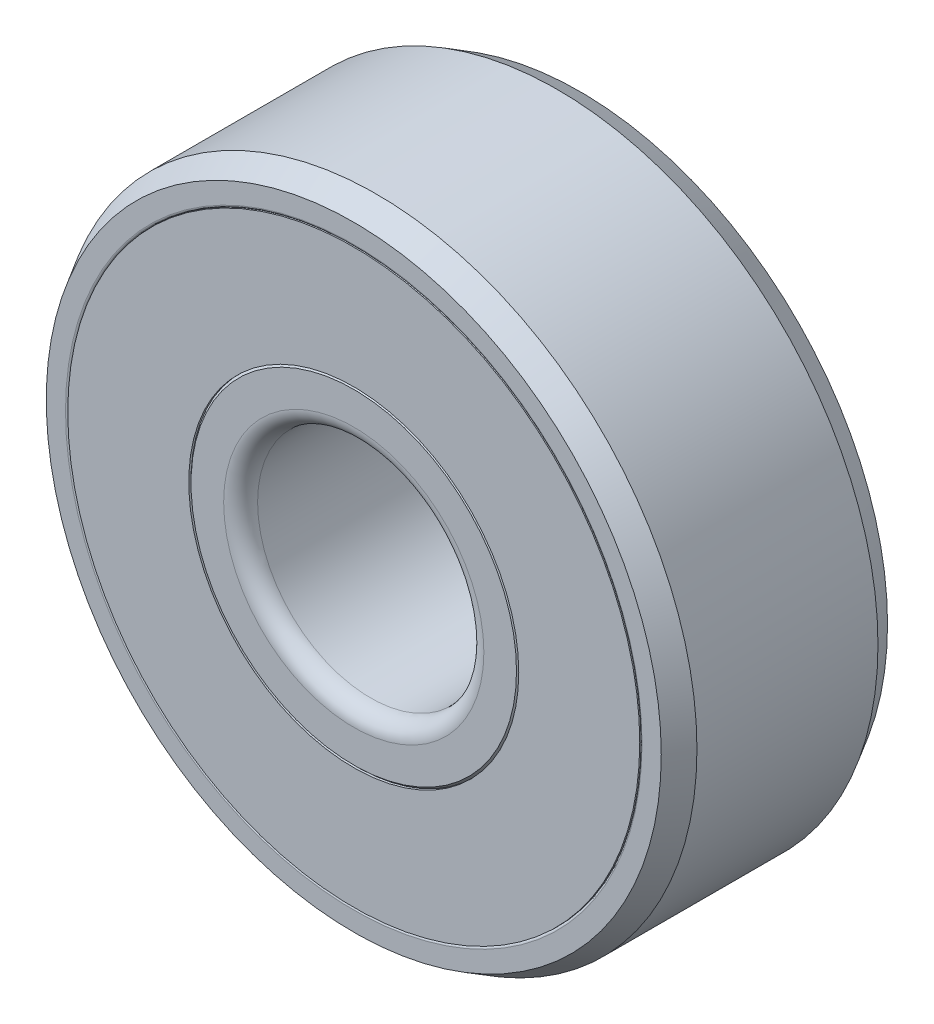
ISO-10303-21;
HEADER;
FILE_DESCRIPTION(('STEP AP214'),'2;1');
FILE_NAME('part.step','',(''),(''),'','','');
FILE_SCHEMA(('AUTOMOTIVE_DESIGN { 1 0 10303 214 1 1 1 1 }'));
ENDSEC;
DATA;
#1=APPLICATION_CONTEXT('core data for automotive mechanical design processes');
#2=APPLICATION_PROTOCOL_DEFINITION('international standard','automotive_design',2000,#1);
#3=PRODUCT_CONTEXT('',#1,'mechanical');
#4=PRODUCT('Part','Part','',(#3));
#5=PRODUCT_RELATED_PRODUCT_CATEGORY('part','',(#4));
#6=PRODUCT_DEFINITION_FORMATION('','',#4);
#7=PRODUCT_DEFINITION_CONTEXT('part definition',#1,'design');
#8=PRODUCT_DEFINITION('design','',#6,#7);
#9=PRODUCT_DEFINITION_SHAPE('','',#8);
#10=(LENGTH_UNIT() NAMED_UNIT(*) SI_UNIT(.MILLI.,.METRE.));
#11=(NAMED_UNIT(*) PLANE_ANGLE_UNIT() SI_UNIT($,.RADIAN.));
#12=(NAMED_UNIT(*) SI_UNIT($,.STERADIAN.) SOLID_ANGLE_UNIT());
#13=UNCERTAINTY_MEASURE_WITH_UNIT(LENGTH_MEASURE(1.E-05),#10,'distance_accuracy_value','');
#14=(GEOMETRIC_REPRESENTATION_CONTEXT(3) GLOBAL_UNCERTAINTY_ASSIGNED_CONTEXT((#13)) GLOBAL_UNIT_ASSIGNED_CONTEXT((#10,
#11,#12)) REPRESENTATION_CONTEXT('',''));
#15=CARTESIAN_POINT('',(0.,0.,0.));
#16=DIRECTION('',(0.,0.,1.));
#17=DIRECTION('',(1.,0.,0.));
#18=AXIS2_PLACEMENT_3D('',#15,#16,#17);
#19=CARTESIAN_POINT('',(4.67470073892338,-3.7279494402804,0.));
#20=DIRECTION('',(-0.781831482468022,0.623489801858743,0.));
#21=DIRECTION('',(0.,0.,-1.));
#22=AXIS2_PLACEMENT_3D('',#19,#20,#21);
#23=SPHERICAL_SURFACE('',#22,2.21527777777778);
#24=CARTESIAN_POINT('',(2.94272682984492,-2.34674633755166,0.));
#25=VERTEX_POINT('',#24);
#26=VERTEX_LOOP('',#25);
#27=FACE_BOUND('',#26,.T.);
#28=ADVANCED_FACE('F41',(#27),#23,.T.);
#29=CLOSED_SHELL('',(#28));
#30=MANIFOLD_SOLID_BREP('B2',#29);
#31=CARTESIAN_POINT('',(5.8292564749205,1.33048975094707,0.));
#32=DIRECTION('',(-0.974927912181826,-0.222520933956305,0.));
#33=DIRECTION('',(0.,0.,-1.));
#34=AXIS2_PLACEMENT_3D('',#31,#32,#33);
#35=SPHERICAL_SURFACE('',#34,2.21527777777778);
#36=CARTESIAN_POINT('',(3.66952033612882,0.837544070863315,0.));
#37=VERTEX_POINT('',#36);
#38=VERTEX_LOOP('',#37);
#39=FACE_BOUND('',#38,.T.);
#40=ADVANCED_FACE('F59',(#39),#35,.T.);
#41=CLOSED_SHELL('',(#40));
#42=MANIFOLD_SOLID_BREP('B6',#41);
#43=CARTESIAN_POINT('',(2.59426319014044,5.38704302266653,0.));
#44=DIRECTION('',(-0.433883739117565,-0.900968867902416,0.));
#45=DIRECTION('',(0.,0.,-1.));
#46=AXIS2_PLACEMENT_3D('',#43,#44,#45);
#47=SPHERICAL_SURFACE('',#46,2.21527777777778);
#48=CARTESIAN_POINT('',(1.63309018473417,3.3911467111327,0.));
#49=VERTEX_POINT('',#48);
#50=VERTEX_LOOP('',#49);
#51=FACE_BOUND('',#50,.T.);
#52=ADVANCED_FACE('F77',(#51),#47,.T.);
#53=CLOSED_SHELL('',(#52));
#54=MANIFOLD_SOLID_BREP('B37',#53);
#55=CARTESIAN_POINT('',(-2.59426319014037,5.38704302266656,0.));
#56=DIRECTION('',(0.433883739117553,-0.900968867902422,0.));
#57=DIRECTION('',(0.,0.,-1.));
#58=AXIS2_PLACEMENT_3D('',#55,#56,#57);
#59=SPHERICAL_SURFACE('',#58,2.21527777777778);
#60=CARTESIAN_POINT('',(-1.63309018473412,3.39114671113273,0.));
#61=VERTEX_POINT('',#60);
#62=VERTEX_LOOP('',#61);
#63=FACE_BOUND('',#62,.T.);
#64=ADVANCED_FACE('F95',(#63),#59,.T.);
#65=CLOSED_SHELL('',(#64));
#66=MANIFOLD_SOLID_BREP('B55',#65);
#67=CARTESIAN_POINT('',(-5.82925647492048,1.33048975094715,0.));
#68=DIRECTION('',(0.974927912181823,-0.222520933956318,0.));
#69=DIRECTION('',(0.,0.,-1.));
#70=AXIS2_PLACEMENT_3D('',#67,#68,#69);
#71=SPHERICAL_SURFACE('',#70,2.21527777777778);
#72=CARTESIAN_POINT('',(-3.66952033612881,0.837544070863364,0.));
#73=VERTEX_POINT('',#72);
#74=VERTEX_LOOP('',#73);
#75=FACE_BOUND('',#74,.T.);
#76=ADVANCED_FACE('F113',(#75),#71,.T.);
#77=CLOSED_SHELL('',(#76));
#78=MANIFOLD_SOLID_BREP('B73',#77);
#79=CARTESIAN_POINT('',(-4.67470073892344,-3.72794944028034,0.));
#80=DIRECTION('',(0.781831482468031,0.623489801858732,0.));
#81=DIRECTION('',(0.,0.,-1.));
#82=AXIS2_PLACEMENT_3D('',#79,#80,#81);
#83=SPHERICAL_SURFACE('',#82,2.21527777777778);
#84=CARTESIAN_POINT('',(-2.94272682984495,-2.34674633755162,0.));
#85=VERTEX_POINT('',#84);
#86=VERTEX_LOOP('',#85);
#87=FACE_BOUND('',#86,.T.);
#88=ADVANCED_FACE('F131',(#87),#83,.T.);
#89=CLOSED_SHELL('',(#88));
#90=MANIFOLD_SOLID_BREP('B91',#89);
#91=CARTESIAN_POINT('',(0.,-5.97916666666667,0.));
#92=DIRECTION('',(0.,1.,0.));
#93=DIRECTION('',(0.,0.,-1.));
#94=AXIS2_PLACEMENT_3D('',#91,#92,#93);
#95=SPHERICAL_SURFACE('',#94,2.21527777777778);
#96=CARTESIAN_POINT('',(0.,-3.76388888888889,0.));
#97=VERTEX_POINT('',#96);
#98=VERTEX_LOOP('',#97);
#99=FACE_BOUND('',#98,.T.);
#100=ADVANCED_FACE('F151',(#99),#95,.T.);
#101=CLOSED_SHELL('',(#100));
#102=MANIFOLD_SOLID_BREP('B109',#101);
#103=CARTESIAN_POINT('',(0.,-4.375,3.));
#104=DIRECTION('',(0.,0.,1.));
#105=DIRECTION('',(1.,0.,0.));
#106=AXIS2_PLACEMENT_3D('',#103,#104,#105);
#107=PLANE('',#106);
#108=CARTESIAN_POINT('',(0.,0.,3.));
#109=DIRECTION('',(0.,0.,1.));
#110=DIRECTION('',(1.,0.,0.));
#111=AXIS2_PLACEMENT_3D('',#108,#109,#110);
#112=CIRCLE('',#111,7.58333333333333);
#113=CARTESIAN_POINT('',(7.58333333333333,0.,3.));
#114=VERTEX_POINT('',#113);
#115=EDGE_CURVE('E150',#114,#114,#112,.T.);
#116=ORIENTED_EDGE('',*,*,#115,.T.);
#117=EDGE_LOOP('',(#116));
#118=FACE_BOUND('',#117,.T.);
#119=CARTESIAN_POINT('',(0.,0.,3.));
#120=DIRECTION('',(0.,0.,1.));
#121=DIRECTION('',(1.,0.,0.));
#122=AXIS2_PLACEMENT_3D('',#119,#120,#121);
#123=CIRCLE('',#122,4.375);
#124=CARTESIAN_POINT('',(4.375,0.,3.));
#125=VERTEX_POINT('',#124);
#126=EDGE_CURVE('E185',#125,#125,#123,.T.);
#127=ORIENTED_EDGE('',*,*,#126,.F.);
#128=EDGE_LOOP('',(#127));
#129=FACE_BOUND('',#128,.T.);
#130=ADVANCED_FACE('F171',(#118,#129),#107,.T.);
#131=CARTESIAN_POINT('',(0.,0.,3.));
#132=DIRECTION('',(0.,0.,1.));
#133=DIRECTION('',(1.,0.,0.));
#134=AXIS2_PLACEMENT_3D('',#131,#132,#133);
#135=CYLINDRICAL_SURFACE('',#134,7.58333333333333);
#136=CARTESIAN_POINT('',(0.,0.,2.41145833333333));
#137=DIRECTION('',(0.,0.,1.));
#138=DIRECTION('',(1.,0.,0.));
#139=AXIS2_PLACEMENT_3D('',#136,#137,#138);
#140=CIRCLE('',#139,7.58333333333333);
#141=CARTESIAN_POINT('',(7.58333333333333,0.,2.41145833333333));
#142=VERTEX_POINT('',#141);
#143=EDGE_CURVE('E177',#142,#142,#140,.T.);
#144=ORIENTED_EDGE('',*,*,#143,.T.);
#145=EDGE_LOOP('',(#144));
#146=FACE_BOUND('',#145,.T.);
#147=ORIENTED_EDGE('',*,*,#115,.F.);
#148=EDGE_LOOP('',(#147));
#149=FACE_BOUND('',#148,.T.);
#150=ADVANCED_FACE('F195',(#146,#149),#135,.T.);
#151=CARTESIAN_POINT('',(0.,-4.375,2.41145833333333));
#152=DIRECTION('',(0.,0.,-1.));
#153=DIRECTION('',(-1.,0.,0.));
#154=AXIS2_PLACEMENT_3D('',#151,#152,#153);
#155=PLANE('',#154);
#156=CARTESIAN_POINT('',(0.,0.,2.41145833333333));
#157=DIRECTION('',(0.,0.,1.));
#158=DIRECTION('',(1.,0.,0.));
#159=AXIS2_PLACEMENT_3D('',#156,#157,#158);
#160=CIRCLE('',#159,4.375);
#161=CARTESIAN_POINT('',(4.375,0.,2.41145833333333));
#162=VERTEX_POINT('',#161);
#163=EDGE_CURVE('E181',#162,#162,#160,.T.);
#164=ORIENTED_EDGE('',*,*,#163,.T.);
#165=EDGE_LOOP('',(#164));
#166=FACE_BOUND('',#165,.T.);
#167=ORIENTED_EDGE('',*,*,#143,.F.);
#168=EDGE_LOOP('',(#167));
#169=FACE_BOUND('',#168,.T.);
#170=ADVANCED_FACE('F199',(#166,#169),#155,.T.);
#171=CARTESIAN_POINT('',(0.,0.,3.));
#172=DIRECTION('',(0.,0.,1.));
#173=DIRECTION('',(1.,0.,0.));
#174=AXIS2_PLACEMENT_3D('',#171,#172,#173);
#175=CYLINDRICAL_SURFACE('',#174,4.375);
#176=ORIENTED_EDGE('',*,*,#126,.T.);
#177=EDGE_LOOP('',(#176));
#178=FACE_BOUND('',#177,.T.);
#179=ORIENTED_EDGE('',*,*,#163,.F.);
#180=EDGE_LOOP('',(#179));
#181=FACE_BOUND('',#180,.T.);
#182=ADVANCED_FACE('F191',(#178,#181),#175,.F.);
#183=CLOSED_SHELL('',(#130,#150,#170,#182));
#184=MANIFOLD_SOLID_BREP('B127',#183);
#185=CARTESIAN_POINT('',(0.,0.,2.55));
#186=DIRECTION('',(0.,0.,1.));
#187=DIRECTION('',(1.,0.,0.));
#188=AXIS2_PLACEMENT_3D('',#185,#186,#187);
#189=TOROIDAL_SURFACE('',#188,3.45,0.45);
#190=CARTESIAN_POINT('',(0.,0.,3.));
#191=DIRECTION('',(0.,0.,1.));
#192=DIRECTION('',(1.,0.,0.));
#193=AXIS2_PLACEMENT_3D('',#190,#191,#192);
#194=CIRCLE('',#193,3.45);
#195=CARTESIAN_POINT('',(3.45,0.,3.));
#196=VERTEX_POINT('',#195);
#197=EDGE_CURVE('E170',#196,#196,#194,.T.);
#198=ORIENTED_EDGE('',*,*,#197,.T.);
#199=EDGE_LOOP('',(#198));
#200=FACE_BOUND('',#199,.T.);
#201=CARTESIAN_POINT('',(0.,0.,2.55));
#202=DIRECTION('',(0.,0.,1.));
#203=DIRECTION('',(1.,0.,0.));
#204=AXIS2_PLACEMENT_3D('',#201,#202,#203);
#205=CIRCLE('',#204,3.);
#206=CARTESIAN_POINT('',(3.,0.,2.55));
#207=VERTEX_POINT('',#206);
#208=EDGE_CURVE('E273',#207,#207,#205,.T.);
#209=ORIENTED_EDGE('',*,*,#208,.F.);
#210=EDGE_LOOP('',(#209));
#211=FACE_BOUND('',#210,.T.);
#212=ADVANCED_FACE('F239',(#200,#211),#189,.T.);
#213=CARTESIAN_POINT('',(0.,-4.315,3.));
#214=DIRECTION('',(0.,0.,1.));
#215=DIRECTION('',(1.,0.,0.));
#216=AXIS2_PLACEMENT_3D('',#213,#214,#215);
#217=PLANE('',#216);
#218=CARTESIAN_POINT('',(0.,0.,3.));
#219=DIRECTION('',(0.,0.,1.));
#220=DIRECTION('',(1.,0.,0.));
#221=AXIS2_PLACEMENT_3D('',#218,#219,#220);
#222=CIRCLE('',#221,4.315);
#223=CARTESIAN_POINT('',(4.315,0.,3.));
#224=VERTEX_POINT('',#223);
#225=EDGE_CURVE('E245',#224,#224,#222,.T.);
#226=ORIENTED_EDGE('',*,*,#225,.T.);
#227=EDGE_LOOP('',(#226));
#228=FACE_BOUND('',#227,.T.);
#229=ORIENTED_EDGE('',*,*,#197,.F.);
#230=EDGE_LOOP('',(#229));
#231=FACE_BOUND('',#230,.T.);
#232=ADVANCED_FACE('F281',(#228,#231),#217,.T.);
#233=CARTESIAN_POINT('',(0.,0.,3.));
#234=DIRECTION('',(0.,0.,-1.));
#235=DIRECTION('',(-1.,0.,0.));
#236=AXIS2_PLACEMENT_3D('',#233,#234,#235);
#237=CONICAL_SURFACE('',#236,4.315,0.785398163397452);
#238=CARTESIAN_POINT('',(0.,0.,2.94));
#239=DIRECTION('',(0.,0.,1.));
#240=DIRECTION('',(1.,0.,0.));
#241=AXIS2_PLACEMENT_3D('',#238,#239,#240);
#242=CIRCLE('',#241,4.375);
#243=CARTESIAN_POINT('',(4.375,0.,2.94));
#244=VERTEX_POINT('',#243);
#245=EDGE_CURVE('E249',#244,#244,#242,.T.);
#246=ORIENTED_EDGE('',*,*,#245,.T.);
#247=EDGE_LOOP('',(#246));
#248=FACE_BOUND('',#247,.T.);
#249=ORIENTED_EDGE('',*,*,#225,.F.);
#250=EDGE_LOOP('',(#249));
#251=FACE_BOUND('',#250,.T.);
#252=ADVANCED_FACE('F285',(#248,#251),#237,.T.);
#253=CARTESIAN_POINT('',(0.,0.,3.));
#254=DIRECTION('',(0.,0.,1.));
#255=DIRECTION('',(1.,0.,0.));
#256=AXIS2_PLACEMENT_3D('',#253,#254,#255);
#257=CYLINDRICAL_SURFACE('',#256,4.375);
#258=CARTESIAN_POINT('',(0.,0.,1.52777777777778));
#259=DIRECTION('',(0.,0.,1.));
#260=DIRECTION('',(1.,0.,0.));
#261=AXIS2_PLACEMENT_3D('',#258,#259,#260);
#262=CIRCLE('',#261,4.375);
#263=CARTESIAN_POINT('',(4.375,0.,1.52777777777778));
#264=VERTEX_POINT('',#263);
#265=EDGE_CURVE('E253',#264,#264,#262,.T.);
#266=ORIENTED_EDGE('',*,*,#265,.T.);
#267=EDGE_LOOP('',(#266));
#268=FACE_BOUND('',#267,.T.);
#269=ORIENTED_EDGE('',*,*,#245,.F.);
#270=EDGE_LOOP('',(#269));
#271=FACE_BOUND('',#270,.T.);
#272=ADVANCED_FACE('F289',(#268,#271),#257,.T.);
#273=CARTESIAN_POINT('',(0.,0.,0.));
#274=DIRECTION('',(0.,0.,1.));
#275=DIRECTION('',(1.,0.,0.));
#276=AXIS2_PLACEMENT_3D('',#273,#274,#275);
#277=TOROIDAL_SURFACE('',#276,5.97916666666667,2.21527777777778);
#278=CARTESIAN_POINT('',(0.,0.,-1.52777777777778));
#279=DIRECTION('',(0.,0.,1.));
#280=DIRECTION('',(1.,0.,0.));
#281=AXIS2_PLACEMENT_3D('',#278,#279,#280);
#282=CIRCLE('',#281,4.375);
#283=CARTESIAN_POINT('',(4.375,0.,-1.52777777777778));
#284=VERTEX_POINT('',#283);
#285=EDGE_CURVE('E258',#284,#284,#282,.T.);
#286=ORIENTED_EDGE('',*,*,#285,.T.);
#287=EDGE_LOOP('',(#286));
#288=FACE_BOUND('',#287,.T.);
#289=ORIENTED_EDGE('',*,*,#265,.F.);
#290=EDGE_LOOP('',(#289));
#291=FACE_BOUND('',#290,.T.);
#292=ADVANCED_FACE('F296',(#288,#291),#277,.F.);
#293=CARTESIAN_POINT('',(0.,0.,3.));
#294=DIRECTION('',(0.,0.,1.));
#295=DIRECTION('',(1.,0.,0.));
#296=AXIS2_PLACEMENT_3D('',#293,#294,#295);
#297=CYLINDRICAL_SURFACE('',#296,4.375);
#298=CARTESIAN_POINT('',(0.,0.,-2.94));
#299=DIRECTION('',(0.,0.,1.));
#300=DIRECTION('',(1.,0.,0.));
#301=AXIS2_PLACEMENT_3D('',#298,#299,#300);
#302=CIRCLE('',#301,4.375);
#303=CARTESIAN_POINT('',(4.375,0.,-2.94));
#304=VERTEX_POINT('',#303);
#305=EDGE_CURVE('E261',#304,#304,#302,.T.);
#306=ORIENTED_EDGE('',*,*,#305,.T.);
#307=EDGE_LOOP('',(#306));
#308=FACE_BOUND('',#307,.T.);
#309=ORIENTED_EDGE('',*,*,#285,.F.);
#310=EDGE_LOOP('',(#309));
#311=FACE_BOUND('',#310,.T.);
#312=ADVANCED_FACE('F300',(#308,#311),#297,.T.);
#313=CARTESIAN_POINT('',(0.,0.,-2.94));
#314=DIRECTION('',(0.,0.,1.));
#315=DIRECTION('',(1.,0.,0.));
#316=AXIS2_PLACEMENT_3D('',#313,#314,#315);
#317=CONICAL_SURFACE('',#316,4.375,0.785398163397455);
#318=CARTESIAN_POINT('',(0.,0.,-3.));
#319=DIRECTION('',(0.,0.,1.));
#320=DIRECTION('',(1.,0.,0.));
#321=AXIS2_PLACEMENT_3D('',#318,#319,#320);
#322=CIRCLE('',#321,4.315);
#323=CARTESIAN_POINT('',(4.315,0.,-3.));
#324=VERTEX_POINT('',#323);
#325=EDGE_CURVE('E264',#324,#324,#322,.T.);
#326=ORIENTED_EDGE('',*,*,#325,.T.);
#327=EDGE_LOOP('',(#326));
#328=FACE_BOUND('',#327,.T.);
#329=ORIENTED_EDGE('',*,*,#305,.F.);
#330=EDGE_LOOP('',(#329));
#331=FACE_BOUND('',#330,.T.);
#332=ADVANCED_FACE('F304',(#328,#331),#317,.T.);
#333=CARTESIAN_POINT('',(0.,-4.315,-3.));
#334=DIRECTION('',(0.,0.,-1.));
#335=DIRECTION('',(-1.,0.,0.));
#336=AXIS2_PLACEMENT_3D('',#333,#334,#335);
#337=PLANE('',#336);
#338=CARTESIAN_POINT('',(0.,0.,-3.));
#339=DIRECTION('',(0.,0.,1.));
#340=DIRECTION('',(1.,0.,0.));
#341=AXIS2_PLACEMENT_3D('',#338,#339,#340);
#342=CIRCLE('',#341,3.45);
#343=CARTESIAN_POINT('',(3.45,0.,-3.));
#344=VERTEX_POINT('',#343);
#345=EDGE_CURVE('E267',#344,#344,#342,.T.);
#346=ORIENTED_EDGE('',*,*,#345,.T.);
#347=EDGE_LOOP('',(#346));
#348=FACE_BOUND('',#347,.T.);
#349=ORIENTED_EDGE('',*,*,#325,.F.);
#350=EDGE_LOOP('',(#349));
#351=FACE_BOUND('',#350,.T.);
#352=ADVANCED_FACE('F308',(#348,#351),#337,.T.);
#353=CARTESIAN_POINT('',(0.,0.,-2.55));
#354=DIRECTION('',(0.,0.,1.));
#355=DIRECTION('',(1.,0.,0.));
#356=AXIS2_PLACEMENT_3D('',#353,#354,#355);
#357=TOROIDAL_SURFACE('',#356,3.45,0.45);
#358=CARTESIAN_POINT('',(0.,0.,-2.55));
#359=DIRECTION('',(0.,0.,1.));
#360=DIRECTION('',(1.,0.,0.));
#361=AXIS2_PLACEMENT_3D('',#358,#359,#360);
#362=CIRCLE('',#361,3.);
#363=CARTESIAN_POINT('',(3.,0.,-2.55));
#364=VERTEX_POINT('',#363);
#365=EDGE_CURVE('E270',#364,#364,#362,.T.);
#366=ORIENTED_EDGE('',*,*,#365,.T.);
#367=EDGE_LOOP('',(#366));
#368=FACE_BOUND('',#367,.T.);
#369=ORIENTED_EDGE('',*,*,#345,.F.);
#370=EDGE_LOOP('',(#369));
#371=FACE_BOUND('',#370,.T.);
#372=ADVANCED_FACE('F312',(#368,#371),#357,.T.);
#373=CARTESIAN_POINT('',(0.,0.,3.));
#374=DIRECTION('',(0.,0.,1.));
#375=DIRECTION('',(1.,0.,0.));
#376=AXIS2_PLACEMENT_3D('',#373,#374,#375);
#377=CYLINDRICAL_SURFACE('',#376,3.);
#378=ORIENTED_EDGE('',*,*,#208,.T.);
#379=EDGE_LOOP('',(#378));
#380=FACE_BOUND('',#379,.T.);
#381=ORIENTED_EDGE('',*,*,#365,.F.);
#382=EDGE_LOOP('',(#381));
#383=FACE_BOUND('',#382,.T.);
#384=ADVANCED_FACE('F277',(#380,#383),#377,.F.);
#385=CLOSED_SHELL('',(#212,#232,#252,#272,#292,#312,#332,#352,#372,#384));
#386=MANIFOLD_SOLID_BREP('B145',#385);
#387=CARTESIAN_POINT('',(0.,0.,3.));
#388=DIRECTION('',(0.,0.,-1.));
#389=DIRECTION('',(-1.,0.,0.));
#390=AXIS2_PLACEMENT_3D('',#387,#388,#389);
#391=CONICAL_SURFACE('',#390,8.15358983848624,0.523598775598278);
#392=CARTESIAN_POINT('',(0.,0.,2.4));
#393=DIRECTION('',(0.,0.,1.));
#394=DIRECTION('',(1.,0.,0.));
#395=AXIS2_PLACEMENT_3D('',#392,#393,#394);
#396=CIRCLE('',#395,8.5);
#397=CARTESIAN_POINT('',(8.5,0.,2.4));
#398=VERTEX_POINT('',#397);
#399=EDGE_CURVE('E238',#398,#398,#396,.T.);
#400=ORIENTED_EDGE('',*,*,#399,.T.);
#401=EDGE_LOOP('',(#400));
#402=FACE_BOUND('',#401,.T.);
#403=CARTESIAN_POINT('',(0.,0.,3.));
#404=DIRECTION('',(0.,0.,1.));
#405=DIRECTION('',(1.,0.,0.));
#406=AXIS2_PLACEMENT_3D('',#403,#404,#405);
#407=CIRCLE('',#406,8.15358983848624);
#408=CARTESIAN_POINT('',(8.15358983848624,0.,3.));
#409=VERTEX_POINT('',#408);
#410=EDGE_CURVE('E424',#409,#409,#407,.T.);
#411=ORIENTED_EDGE('',*,*,#410,.F.);
#412=EDGE_LOOP('',(#411));
#413=FACE_BOUND('',#412,.T.);
#414=ADVANCED_FACE('F390',(#402,#413),#391,.T.);
#415=CARTESIAN_POINT('',(0.,0.,3.));
#416=DIRECTION('',(0.,0.,1.));
#417=DIRECTION('',(1.,0.,0.));
#418=AXIS2_PLACEMENT_3D('',#415,#416,#417);
#419=CYLINDRICAL_SURFACE('',#418,8.5);
#420=CARTESIAN_POINT('',(0.,0.,-2.4));
#421=DIRECTION('',(0.,0.,1.));
#422=DIRECTION('',(1.,0.,0.));
#423=AXIS2_PLACEMENT_3D('',#420,#421,#422);
#424=CIRCLE('',#423,8.5);
#425=CARTESIAN_POINT('',(8.5,0.,-2.4));
#426=VERTEX_POINT('',#425);
#427=EDGE_CURVE('E396',#426,#426,#424,.T.);
#428=ORIENTED_EDGE('',*,*,#427,.T.);
#429=EDGE_LOOP('',(#428));
#430=FACE_BOUND('',#429,.T.);
#431=ORIENTED_EDGE('',*,*,#399,.F.);
#432=EDGE_LOOP('',(#431));
#433=FACE_BOUND('',#432,.T.);
#434=ADVANCED_FACE('F432',(#430,#433),#419,.T.);
#435=CARTESIAN_POINT('',(0.,0.,-2.4));
#436=DIRECTION('',(0.,0.,1.));
#437=DIRECTION('',(1.,0.,0.));
#438=AXIS2_PLACEMENT_3D('',#435,#436,#437);
#439=CONICAL_SURFACE('',#438,8.5,0.523598775598278);
#440=CARTESIAN_POINT('',(0.,0.,-3.));
#441=DIRECTION('',(0.,0.,1.));
#442=DIRECTION('',(1.,0.,0.));
#443=AXIS2_PLACEMENT_3D('',#440,#441,#442);
#444=CIRCLE('',#443,8.15358983848624);
#445=CARTESIAN_POINT('',(8.15358983848624,0.,-3.));
#446=VERTEX_POINT('',#445);
#447=EDGE_CURVE('E400',#446,#446,#444,.T.);
#448=ORIENTED_EDGE('',*,*,#447,.T.);
#449=EDGE_LOOP('',(#448));
#450=FACE_BOUND('',#449,.T.);
#451=ORIENTED_EDGE('',*,*,#427,.F.);
#452=EDGE_LOOP('',(#451));
#453=FACE_BOUND('',#452,.T.);
#454=ADVANCED_FACE('F436',(#450,#453),#439,.T.);
#455=CARTESIAN_POINT('',(0.,-7.64333333333333,-3.));
#456=DIRECTION('',(0.,0.,-1.));
#457=DIRECTION('',(-1.,0.,0.));
#458=AXIS2_PLACEMENT_3D('',#455,#456,#457);
#459=PLANE('',#458);
#460=CARTESIAN_POINT('',(0.,0.,-3.));
#461=DIRECTION('',(0.,0.,1.));
#462=DIRECTION('',(1.,0.,0.));
#463=AXIS2_PLACEMENT_3D('',#460,#461,#462);
#464=CIRCLE('',#463,7.64333333333333);
#465=CARTESIAN_POINT('',(7.64333333333333,0.,-3.));
#466=VERTEX_POINT('',#465);
#467=EDGE_CURVE('E404',#466,#466,#464,.T.);
#468=ORIENTED_EDGE('',*,*,#467,.T.);
#469=EDGE_LOOP('',(#468));
#470=FACE_BOUND('',#469,.T.);
#471=ORIENTED_EDGE('',*,*,#447,.F.);
#472=EDGE_LOOP('',(#471));
#473=FACE_BOUND('',#472,.T.);
#474=ADVANCED_FACE('F440',(#470,#473),#459,.T.);
#475=CARTESIAN_POINT('',(0.,0.,-2.94));
#476=DIRECTION('',(0.,0.,1.));
#477=DIRECTION('',(1.,0.,0.));
#478=AXIS2_PLACEMENT_3D('',#475,#476,#477);
#479=TOROIDAL_SURFACE('',#478,7.64333333333333,0.0599999999999999);
#480=CARTESIAN_POINT('',(0.,0.,-2.94));
#481=DIRECTION('',(0.,0.,1.));
#482=DIRECTION('',(1.,0.,0.));
#483=AXIS2_PLACEMENT_3D('',#480,#481,#482);
#484=CIRCLE('',#483,7.58333333333333);
#485=CARTESIAN_POINT('',(7.58333333333333,0.,-2.94));
#486=VERTEX_POINT('',#485);
#487=EDGE_CURVE('E409',#486,#486,#484,.T.);
#488=ORIENTED_EDGE('',*,*,#487,.T.);
#489=EDGE_LOOP('',(#488));
#490=FACE_BOUND('',#489,.T.);
#491=ORIENTED_EDGE('',*,*,#467,.F.);
#492=EDGE_LOOP('',(#491));
#493=FACE_BOUND('',#492,.T.);
#494=ADVANCED_FACE('F447',(#490,#493),#479,.T.);
#495=CARTESIAN_POINT('',(0.,0.,3.));
#496=DIRECTION('',(0.,0.,1.));
#497=DIRECTION('',(1.,0.,0.));
#498=AXIS2_PLACEMENT_3D('',#495,#496,#497);
#499=CYLINDRICAL_SURFACE('',#498,7.58333333333333);
#500=CARTESIAN_POINT('',(0.,0.,-1.52777777777778));
#501=DIRECTION('',(0.,0.,1.));
#502=DIRECTION('',(1.,0.,0.));
#503=AXIS2_PLACEMENT_3D('',#500,#501,#502);
#504=CIRCLE('',#503,7.58333333333333);
#505=CARTESIAN_POINT('',(7.58333333333333,0.,-1.52777777777778));
#506=VERTEX_POINT('',#505);
#507=EDGE_CURVE('E412',#506,#506,#504,.T.);
#508=ORIENTED_EDGE('',*,*,#507,.T.);
#509=EDGE_LOOP('',(#508));
#510=FACE_BOUND('',#509,.T.);
#511=ORIENTED_EDGE('',*,*,#487,.F.);
#512=EDGE_LOOP('',(#511));
#513=FACE_BOUND('',#512,.T.);
#514=ADVANCED_FACE('F451',(#510,#513),#499,.F.);
#515=CARTESIAN_POINT('',(0.,0.,0.));
#516=DIRECTION('',(0.,0.,1.));
#517=DIRECTION('',(1.,0.,0.));
#518=AXIS2_PLACEMENT_3D('',#515,#516,#517);
#519=TOROIDAL_SURFACE('',#518,5.97916666666667,2.21527777777778);
#520=CARTESIAN_POINT('',(0.,0.,1.52777777777778));
#521=DIRECTION('',(0.,0.,1.));
#522=DIRECTION('',(1.,0.,0.));
#523=AXIS2_PLACEMENT_3D('',#520,#521,#522);
#524=CIRCLE('',#523,7.58333333333333);
#525=CARTESIAN_POINT('',(7.58333333333333,0.,1.52777777777778));
#526=VERTEX_POINT('',#525);
#527=EDGE_CURVE('E415',#526,#526,#524,.T.);
#528=ORIENTED_EDGE('',*,*,#527,.T.);
#529=EDGE_LOOP('',(#528));
#530=FACE_BOUND('',#529,.T.);
#531=ORIENTED_EDGE('',*,*,#507,.F.);
#532=EDGE_LOOP('',(#531));
#533=FACE_BOUND('',#532,.T.);
#534=ADVANCED_FACE('F455',(#530,#533),#519,.F.);
#535=CARTESIAN_POINT('',(0.,0.,3.));
#536=DIRECTION('',(0.,0.,1.));
#537=DIRECTION('',(1.,0.,0.));
#538=AXIS2_PLACEMENT_3D('',#535,#536,#537);
#539=CYLINDRICAL_SURFACE('',#538,7.58333333333333);
#540=CARTESIAN_POINT('',(0.,0.,2.94));
#541=DIRECTION('',(0.,0.,1.));
#542=DIRECTION('',(1.,0.,0.));
#543=AXIS2_PLACEMENT_3D('',#540,#541,#542);
#544=CIRCLE('',#543,7.58333333333333);
#545=CARTESIAN_POINT('',(7.58333333333333,0.,2.94));
#546=VERTEX_POINT('',#545);
#547=EDGE_CURVE('E418',#546,#546,#544,.T.);
#548=ORIENTED_EDGE('',*,*,#547,.T.);
#549=EDGE_LOOP('',(#548));
#550=FACE_BOUND('',#549,.T.);
#551=ORIENTED_EDGE('',*,*,#527,.F.);
#552=EDGE_LOOP('',(#551));
#553=FACE_BOUND('',#552,.T.);
#554=ADVANCED_FACE('F459',(#550,#553),#539,.F.);
#555=CARTESIAN_POINT('',(0.,0.,2.94));
#556=DIRECTION('',(0.,0.,1.));
#557=DIRECTION('',(1.,0.,0.));
#558=AXIS2_PLACEMENT_3D('',#555,#556,#557);
#559=TOROIDAL_SURFACE('',#558,7.64333333333333,0.0599999999999999);
#560=CARTESIAN_POINT('',(0.,0.,3.));
#561=DIRECTION('',(0.,0.,1.));
#562=DIRECTION('',(1.,0.,0.));
#563=AXIS2_PLACEMENT_3D('',#560,#561,#562);
#564=CIRCLE('',#563,7.64333333333333);
#565=CARTESIAN_POINT('',(7.64333333333333,0.,3.));
#566=VERTEX_POINT('',#565);
#567=EDGE_CURVE('E421',#566,#566,#564,.T.);
#568=ORIENTED_EDGE('',*,*,#567,.T.);
#569=EDGE_LOOP('',(#568));
#570=FACE_BOUND('',#569,.T.);
#571=ORIENTED_EDGE('',*,*,#547,.F.);
#572=EDGE_LOOP('',(#571));
#573=FACE_BOUND('',#572,.T.);
#574=ADVANCED_FACE('F463',(#570,#573),#559,.T.);
#575=CARTESIAN_POINT('',(0.,-7.64333333333333,3.));
#576=DIRECTION('',(0.,0.,1.));
#577=DIRECTION('',(1.,0.,0.));
#578=AXIS2_PLACEMENT_3D('',#575,#576,#577);
#579=PLANE('',#578);
#580=ORIENTED_EDGE('',*,*,#410,.T.);
#581=EDGE_LOOP('',(#580));
#582=FACE_BOUND('',#581,.T.);
#583=ORIENTED_EDGE('',*,*,#567,.F.);
#584=EDGE_LOOP('',(#583));
#585=FACE_BOUND('',#584,.T.);
#586=ADVANCED_FACE('F428',(#582,#585),#579,.T.);
#587=CLOSED_SHELL('',(#414,#434,#454,#474,#494,#514,#534,#554,#574,#586));
#588=MANIFOLD_SOLID_BREP('B165',#587);
#589=ADVANCED_BREP_SHAPE_REPRESENTATION('',(#18,#30,#42,#54,#66,#78,#90,#102,#184,#386,#588),#14);
#590=SHAPE_DEFINITION_REPRESENTATION(#9,#589);
ENDSEC;
END-ISO-10303-21;
